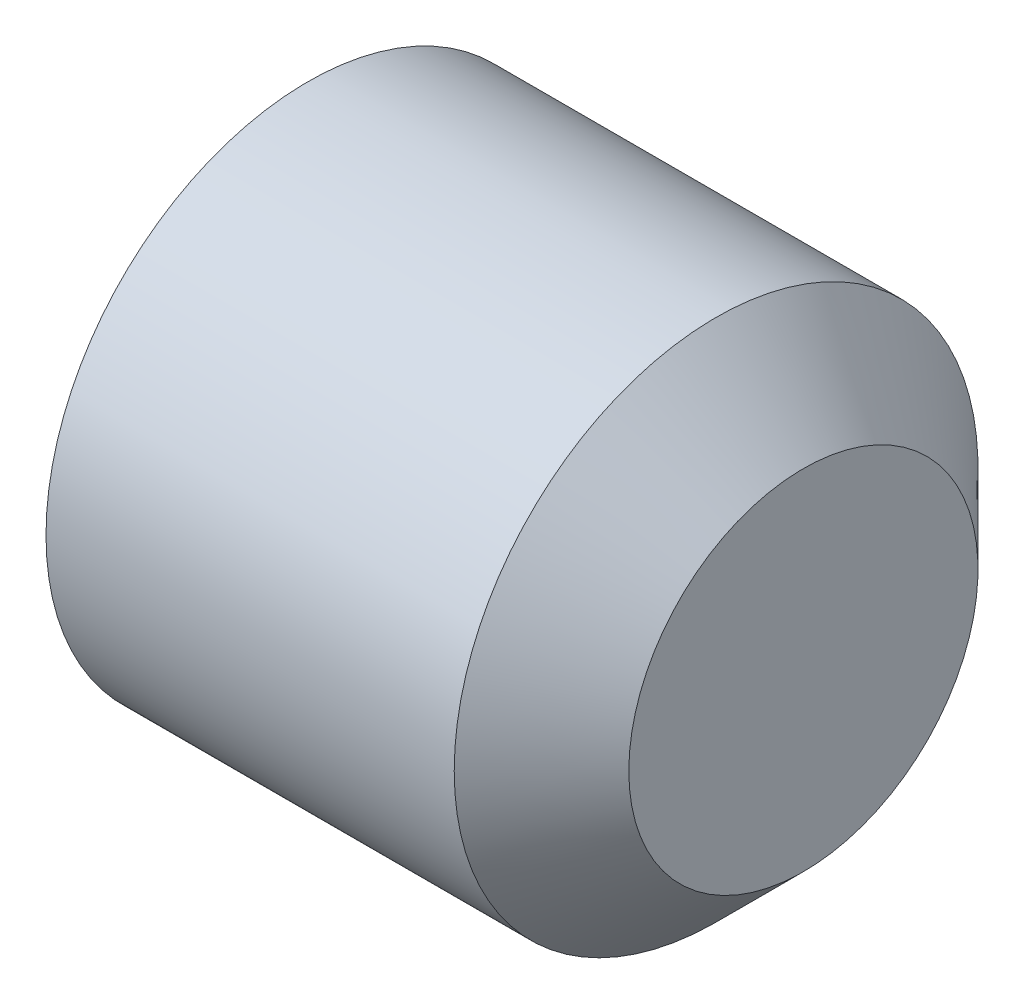
ISO-10303-21;
HEADER;
FILE_DESCRIPTION(('STEP AP214'),'2;1');
FILE_NAME('part.step','',(''),(''),'','','');
FILE_SCHEMA(('AUTOMOTIVE_DESIGN { 1 0 10303 214 1 1 1 1 }'));
ENDSEC;
DATA;
#1=APPLICATION_CONTEXT('core data for automotive mechanical design processes');
#2=APPLICATION_PROTOCOL_DEFINITION('international standard','automotive_design',2000,#1);
#3=PRODUCT_CONTEXT('',#1,'mechanical');
#4=PRODUCT('Part','Part','',(#3));
#5=PRODUCT_RELATED_PRODUCT_CATEGORY('part','',(#4));
#6=PRODUCT_DEFINITION_FORMATION('','',#4);
#7=PRODUCT_DEFINITION_CONTEXT('part definition',#1,'design');
#8=PRODUCT_DEFINITION('design','',#6,#7);
#9=PRODUCT_DEFINITION_SHAPE('','',#8);
#10=(LENGTH_UNIT() NAMED_UNIT(*) SI_UNIT(.MILLI.,.METRE.));
#11=(NAMED_UNIT(*) PLANE_ANGLE_UNIT() SI_UNIT($,.RADIAN.));
#12=(NAMED_UNIT(*) SI_UNIT($,.STERADIAN.) SOLID_ANGLE_UNIT());
#13=UNCERTAINTY_MEASURE_WITH_UNIT(LENGTH_MEASURE(1.E-05),#10,'distance_accuracy_value','');
#14=(GEOMETRIC_REPRESENTATION_CONTEXT(3) GLOBAL_UNCERTAINTY_ASSIGNED_CONTEXT((#13)) GLOBAL_UNIT_ASSIGNED_CONTEXT((#10,
#11,#12)) REPRESENTATION_CONTEXT('',''));
#15=CARTESIAN_POINT('',(0.,0.,0.));
#16=DIRECTION('',(0.,0.,1.));
#17=DIRECTION('',(1.,0.,0.));
#18=AXIS2_PLACEMENT_3D('',#15,#16,#17);
#19=CARTESIAN_POINT('',(0.,0.,0.));
#20=DIRECTION('',(-1.,0.,0.));
#21=DIRECTION('',(0.,0.,1.));
#22=AXIS2_PLACEMENT_3D('',#19,#20,#21);
#23=PLANE('',#22);
#24=CARTESIAN_POINT('',(0.,0.,0.));
#25=DIRECTION('',(-1.,0.,0.));
#26=DIRECTION('',(0.,0.,1.));
#27=AXIS2_PLACEMENT_3D('',#24,#25,#26);
#28=CIRCLE('',#27,1.2195);
#29=CARTESIAN_POINT('',(0.,0.,1.2195));
#30=VERTEX_POINT('',#29);
#31=EDGE_CURVE('E138',#30,#30,#28,.T.);
#32=ORIENTED_EDGE('',*,*,#31,.T.);
#33=EDGE_LOOP('',(#32));
#34=FACE_BOUND('',#33,.T.);
#35=DIRECTION('',(0.,0.,-1.));
#36=VECTOR('',#35,1.);
#37=CARTESIAN_POINT('',(0.,0.750000000000003,0.433012701892216));
#38=LINE('',#37,#36);
#39=CARTESIAN_POINT('',(0.,0.750000000000003,0.433012701892216));
#40=VERTEX_POINT('',#39);
#41=CARTESIAN_POINT('',(0.,0.750000000000003,-0.433012701892222));
#42=VERTEX_POINT('',#41);
#43=EDGE_CURVE('E129',#40,#42,#38,.T.);
#44=ORIENTED_EDGE('',*,*,#43,.F.);
#45=DIRECTION('',(0.,-0.866025403784439,0.5));
#46=VECTOR('',#45,1.);
#47=CARTESIAN_POINT('',(0.,0.750000000000003,0.433012701892216));
#48=LINE('',#47,#46);
#49=CARTESIAN_POINT('',(0.,0.,0.866025403784435));
#50=VERTEX_POINT('',#49);
#51=EDGE_CURVE('E51',#40,#50,#48,.T.);
#52=ORIENTED_EDGE('',*,*,#51,.T.);
#53=DIRECTION('',(0.,0.866025403784439,0.5));
#54=VECTOR('',#53,1.);
#55=CARTESIAN_POINT('',(0.,-0.749999999999996,0.433012701892216));
#56=LINE('',#55,#54);
#57=CARTESIAN_POINT('',(0.,-0.749999999999996,0.433012701892216));
#58=VERTEX_POINT('',#57);
#59=EDGE_CURVE('E120',#58,#50,#56,.T.);
#60=ORIENTED_EDGE('',*,*,#59,.F.);
#61=DIRECTION('',(0.,0.,-1.));
#62=VECTOR('',#61,1.);
#63=CARTESIAN_POINT('',(0.,-0.749999999999996,0.433012701892216));
#64=LINE('',#63,#62);
#65=CARTESIAN_POINT('',(0.,-0.749999999999996,-0.433012701892222));
#66=VERTEX_POINT('',#65);
#67=EDGE_CURVE('E123',#58,#66,#64,.T.);
#68=ORIENTED_EDGE('',*,*,#67,.T.);
#69=DIRECTION('',(0.,0.866025403784438,-0.500000000000001));
#70=VECTOR('',#69,1.);
#71=CARTESIAN_POINT('',(0.,-0.749999999999996,-0.433012701892222));
#72=LINE('',#71,#70);
#73=CARTESIAN_POINT('',(0.,0.,-0.866025403784441));
#74=VERTEX_POINT('',#73);
#75=EDGE_CURVE('E126',#66,#74,#72,.T.);
#76=ORIENTED_EDGE('',*,*,#75,.T.);
#77=DIRECTION('',(0.,-0.866025403784439,-0.5));
#78=VECTOR('',#77,1.);
#79=CARTESIAN_POINT('',(0.,0.750000000000003,-0.433012701892222));
#80=LINE('',#79,#78);
#81=EDGE_CURVE('E109',#42,#74,#80,.T.);
#82=ORIENTED_EDGE('',*,*,#81,.F.);
#83=EDGE_LOOP('',(#44,#52,#60,#68,#76,#82));
#84=FACE_BOUND('',#83,.T.);
#85=ADVANCED_FACE('F36',(#34,#84),#23,.T.);
#86=CARTESIAN_POINT('',(3.,1.,0.));
#87=DIRECTION('',(1.,0.,0.));
#88=DIRECTION('',(0.,0.,-1.));
#89=AXIS2_PLACEMENT_3D('',#86,#87,#88);
#90=PLANE('',#89);
#91=CARTESIAN_POINT('',(3.,0.,0.));
#92=DIRECTION('',(-1.,0.,0.));
#93=DIRECTION('',(0.,0.,1.));
#94=AXIS2_PLACEMENT_3D('',#91,#92,#93);
#95=CIRCLE('',#94,1.);
#96=CARTESIAN_POINT('',(3.,0.,1.));
#97=VERTEX_POINT('',#96);
#98=EDGE_CURVE('E11',#97,#97,#95,.T.);
#99=ORIENTED_EDGE('',*,*,#98,.F.);
#100=EDGE_LOOP('',(#99));
#101=FACE_BOUND('',#100,.T.);
#102=ADVANCED_FACE('F38',(#101),#90,.T.);
#103=CARTESIAN_POINT('',(2.50000000000001,0.,0.));
#104=DIRECTION('',(-1.,0.,0.));
#105=DIRECTION('',(0.,0.,1.));
#106=AXIS2_PLACEMENT_3D('',#103,#104,#105);
#107=CONICAL_SURFACE('',#106,1.5,0.785398163397455);
#108=ORIENTED_EDGE('',*,*,#98,.T.);
#109=EDGE_LOOP('',(#108));
#110=FACE_BOUND('',#109,.T.);
#111=CARTESIAN_POINT('',(2.50000000000001,0.,0.));
#112=DIRECTION('',(-1.,0.,0.));
#113=DIRECTION('',(0.,0.,1.));
#114=AXIS2_PLACEMENT_3D('',#111,#112,#113);
#115=CIRCLE('',#114,1.5);
#116=CARTESIAN_POINT('',(2.50000000000001,0.,1.5));
#117=VERTEX_POINT('',#116);
#118=EDGE_CURVE('E44',#117,#117,#115,.T.);
#119=ORIENTED_EDGE('',*,*,#118,.F.);
#120=EDGE_LOOP('',(#119));
#121=FACE_BOUND('',#120,.T.);
#122=ADVANCED_FACE('F149',(#110,#121),#107,.T.);
#123=CARTESIAN_POINT('',(-12.7,0.,0.));
#124=DIRECTION('',(-1.,0.,0.));
#125=DIRECTION('',(0.,0.,1.));
#126=AXIS2_PLACEMENT_3D('',#123,#124,#125);
#127=CYLINDRICAL_SURFACE('',#126,1.5);
#128=ORIENTED_EDGE('',*,*,#118,.T.);
#129=EDGE_LOOP('',(#128));
#130=FACE_BOUND('',#129,.T.);
#131=CARTESIAN_POINT('',(0.161946750507689,0.,0.));
#132=DIRECTION('',(-1.,0.,0.));
#133=DIRECTION('',(0.,0.,1.));
#134=AXIS2_PLACEMENT_3D('',#131,#132,#133);
#135=CIRCLE('',#134,1.5);
#136=CARTESIAN_POINT('',(0.161946750507689,0.,1.5));
#137=VERTEX_POINT('',#136);
#138=EDGE_CURVE('E141',#137,#137,#135,.T.);
#139=ORIENTED_EDGE('',*,*,#138,.F.);
#140=EDGE_LOOP('',(#139));
#141=FACE_BOUND('',#140,.T.);
#142=ADVANCED_FACE('F146',(#130,#141),#127,.T.);
#143=CARTESIAN_POINT('',(0.,0.,0.));
#144=DIRECTION('',(1.,0.,0.));
#145=DIRECTION('',(0.,0.,-1.));
#146=AXIS2_PLACEMENT_3D('',#143,#144,#145);
#147=CONICAL_SURFACE('',#146,1.2195,1.0471975511966);
#148=ORIENTED_EDGE('',*,*,#138,.T.);
#149=EDGE_LOOP('',(#148));
#150=FACE_BOUND('',#149,.T.);
#151=ORIENTED_EDGE('',*,*,#31,.F.);
#152=EDGE_LOOP('',(#151));
#153=FACE_BOUND('',#152,.T.);
#154=ADVANCED_FACE('F156',(#150,#153),#147,.T.);
#155=CARTESIAN_POINT('',(1.5,0.750000000000003,0.433012701892216));
#156=DIRECTION('',(0.,-0.5,-0.866025403784438));
#157=DIRECTION('',(0.,0.866025403784439,-0.5));
#158=AXIS2_PLACEMENT_3D('',#155,#156,#157);
#159=PLANE('',#158);
#160=ORIENTED_EDGE('',*,*,#51,.F.);
#161=DIRECTION('',(-1.,0.,0.));
#162=VECTOR('',#161,1.);
#163=CARTESIAN_POINT('',(1.5,0.750000000000003,0.433012701892216));
#164=LINE('',#163,#162);
#165=CARTESIAN_POINT('',(1.5,0.750000000000003,0.433012701892216));
#166=VERTEX_POINT('',#165);
#167=EDGE_CURVE('E56',#166,#40,#164,.T.);
#168=ORIENTED_EDGE('',*,*,#167,.F.);
#169=DIRECTION('',(0.,-0.866025403784439,0.5));
#170=VECTOR('',#169,1.);
#171=CARTESIAN_POINT('',(1.5,0.750000000000003,0.433012701892216));
#172=LINE('',#171,#170);
#173=CARTESIAN_POINT('',(1.5,0.,0.866025403784435));
#174=VERTEX_POINT('',#173);
#175=EDGE_CURVE('E83',#166,#174,#172,.T.);
#176=ORIENTED_EDGE('',*,*,#175,.T.);
#177=DIRECTION('',(-1.,0.,0.));
#178=VECTOR('',#177,1.);
#179=CARTESIAN_POINT('',(1.5,0.,0.866025403784435));
#180=LINE('',#179,#178);
#181=EDGE_CURVE('E136',#174,#50,#180,.T.);
#182=ORIENTED_EDGE('',*,*,#181,.T.);
#183=EDGE_LOOP('',(#160,#168,#176,#182));
#184=FACE_BOUND('',#183,.T.);
#185=ADVANCED_FACE('F167',(#184),#159,.T.);
#186=CARTESIAN_POINT('',(1.5,-0.749999999999996,0.433012701892216));
#187=DIRECTION('',(0.,-0.5,0.866025403784439));
#188=DIRECTION('',(0.,-0.866025403784439,-0.5));
#189=AXIS2_PLACEMENT_3D('',#186,#187,#188);
#190=PLANE('',#189);
#191=ORIENTED_EDGE('',*,*,#59,.T.);
#192=ORIENTED_EDGE('',*,*,#181,.F.);
#193=DIRECTION('',(0.,0.866025403784439,0.5));
#194=VECTOR('',#193,1.);
#195=CARTESIAN_POINT('',(1.5,-0.749999999999996,0.433012701892216));
#196=LINE('',#195,#194);
#197=CARTESIAN_POINT('',(1.5,-0.749999999999996,0.433012701892216));
#198=VERTEX_POINT('',#197);
#199=EDGE_CURVE('E269',#198,#174,#196,.T.);
#200=ORIENTED_EDGE('',*,*,#199,.F.);
#201=DIRECTION('',(-1.,0.,0.));
#202=VECTOR('',#201,1.);
#203=CARTESIAN_POINT('',(1.5,-0.749999999999996,0.433012701892216));
#204=LINE('',#203,#202);
#205=EDGE_CURVE('E134',#198,#58,#204,.T.);
#206=ORIENTED_EDGE('',*,*,#205,.T.);
#207=EDGE_LOOP('',(#191,#192,#200,#206));
#208=FACE_BOUND('',#207,.T.);
#209=ADVANCED_FACE('F174',(#208),#190,.F.);
#210=CARTESIAN_POINT('',(1.5,-0.749999999999996,0.433012701892216));
#211=DIRECTION('',(0.,1.,0.));
#212=DIRECTION('',(0.,0.,1.));
#213=AXIS2_PLACEMENT_3D('',#210,#211,#212);
#214=PLANE('',#213);
#215=ORIENTED_EDGE('',*,*,#67,.F.);
#216=ORIENTED_EDGE('',*,*,#205,.F.);
#217=DIRECTION('',(0.,0.,-1.));
#218=VECTOR('',#217,1.);
#219=CARTESIAN_POINT('',(1.5,-0.749999999999996,0.433012701892216));
#220=LINE('',#219,#218);
#221=CARTESIAN_POINT('',(1.5,-0.749999999999996,-0.433012701892222));
#222=VERTEX_POINT('',#221);
#223=EDGE_CURVE('E104',#198,#222,#220,.T.);
#224=ORIENTED_EDGE('',*,*,#223,.T.);
#225=DIRECTION('',(-1.,0.,0.));
#226=VECTOR('',#225,1.);
#227=CARTESIAN_POINT('',(1.5,-0.749999999999996,-0.433012701892222));
#228=LINE('',#227,#226);
#229=EDGE_CURVE('E99',#222,#66,#228,.T.);
#230=ORIENTED_EDGE('',*,*,#229,.T.);
#231=EDGE_LOOP('',(#215,#216,#224,#230));
#232=FACE_BOUND('',#231,.T.);
#233=ADVANCED_FACE('F181',(#232),#214,.T.);
#234=CARTESIAN_POINT('',(1.5,-0.749999999999996,-0.433012701892222));
#235=DIRECTION('',(0.,0.500000000000001,0.866025403784438));
#236=DIRECTION('',(0.,-0.866025403784438,0.500000000000001));
#237=AXIS2_PLACEMENT_3D('',#234,#235,#236);
#238=PLANE('',#237);
#239=ORIENTED_EDGE('',*,*,#75,.F.);
#240=ORIENTED_EDGE('',*,*,#229,.F.);
#241=DIRECTION('',(0.,0.866025403784438,-0.500000000000001));
#242=VECTOR('',#241,1.);
#243=CARTESIAN_POINT('',(1.5,-0.749999999999996,-0.433012701892222));
#244=LINE('',#243,#242);
#245=CARTESIAN_POINT('',(1.5,0.,-0.866025403784441));
#246=VERTEX_POINT('',#245);
#247=EDGE_CURVE('E94',#222,#246,#244,.T.);
#248=ORIENTED_EDGE('',*,*,#247,.T.);
#249=DIRECTION('',(-1.,0.,0.));
#250=VECTOR('',#249,1.);
#251=CARTESIAN_POINT('',(1.5,0.,-0.866025403784441));
#252=LINE('',#251,#250);
#253=EDGE_CURVE('E98',#246,#74,#252,.T.);
#254=ORIENTED_EDGE('',*,*,#253,.T.);
#255=EDGE_LOOP('',(#239,#240,#248,#254));
#256=FACE_BOUND('',#255,.T.);
#257=ADVANCED_FACE('F97',(#256),#238,.T.);
#258=CARTESIAN_POINT('',(1.5,0.750000000000003,-0.433012701892222));
#259=DIRECTION('',(0.,0.5,-0.866025403784439));
#260=DIRECTION('',(0.,0.866025403784439,0.5));
#261=AXIS2_PLACEMENT_3D('',#258,#259,#260);
#262=PLANE('',#261);
#263=ORIENTED_EDGE('',*,*,#81,.T.);
#264=ORIENTED_EDGE('',*,*,#253,.F.);
#265=DIRECTION('',(0.,-0.866025403784439,-0.5));
#266=VECTOR('',#265,1.);
#267=CARTESIAN_POINT('',(1.5,0.750000000000003,-0.433012701892222));
#268=LINE('',#267,#266);
#269=CARTESIAN_POINT('',(1.5,0.750000000000003,-0.433012701892222));
#270=VERTEX_POINT('',#269);
#271=EDGE_CURVE('E103',#270,#246,#268,.T.);
#272=ORIENTED_EDGE('',*,*,#271,.F.);
#273=DIRECTION('',(-1.,0.,0.));
#274=VECTOR('',#273,1.);
#275=CARTESIAN_POINT('',(1.5,0.750000000000003,-0.433012701892222));
#276=LINE('',#275,#274);
#277=EDGE_CURVE('E79',#270,#42,#276,.T.);
#278=ORIENTED_EDGE('',*,*,#277,.T.);
#279=EDGE_LOOP('',(#263,#264,#272,#278));
#280=FACE_BOUND('',#279,.T.);
#281=ADVANCED_FACE('F106',(#280),#262,.F.);
#282=CARTESIAN_POINT('',(1.5,0.750000000000003,0.433012701892216));
#283=DIRECTION('',(0.,1.,0.));
#284=DIRECTION('',(0.,0.,1.));
#285=AXIS2_PLACEMENT_3D('',#282,#283,#284);
#286=PLANE('',#285);
#287=ORIENTED_EDGE('',*,*,#43,.T.);
#288=ORIENTED_EDGE('',*,*,#277,.F.);
#289=DIRECTION('',(0.,0.,-1.));
#290=VECTOR('',#289,1.);
#291=CARTESIAN_POINT('',(1.5,0.750000000000003,0.433012701892216));
#292=LINE('',#291,#290);
#293=EDGE_CURVE('E114',#166,#270,#292,.T.);
#294=ORIENTED_EDGE('',*,*,#293,.F.);
#295=ORIENTED_EDGE('',*,*,#167,.T.);
#296=EDGE_LOOP('',(#287,#288,#294,#295));
#297=FACE_BOUND('',#296,.T.);
#298=ADVANCED_FACE('F193',(#297),#286,.F.);
#299=CARTESIAN_POINT('',(1.5,1.5,0.));
#300=DIRECTION('',(1.,0.,0.));
#301=DIRECTION('',(0.,0.,-1.));
#302=AXIS2_PLACEMENT_3D('',#299,#300,#301);
#303=PLANE('',#302);
#304=ORIENTED_EDGE('',*,*,#175,.F.);
#305=ORIENTED_EDGE('',*,*,#293,.T.);
#306=ORIENTED_EDGE('',*,*,#271,.T.);
#307=ORIENTED_EDGE('',*,*,#247,.F.);
#308=ORIENTED_EDGE('',*,*,#223,.F.);
#309=ORIENTED_EDGE('',*,*,#199,.T.);
#310=EDGE_LOOP('',(#304,#305,#306,#307,#308,#309));
#311=FACE_BOUND('',#310,.T.);
#312=ADVANCED_FACE('F112',(#311),#303,.F.);
#313=CLOSED_SHELL('',(#85,#102,#122,#142,#154,#185,#209,#233,#257,#281,#298,#312));
#314=MANIFOLD_SOLID_BREP('B2',#313);
#315=ADVANCED_BREP_SHAPE_REPRESENTATION('',(#18,#314),#14);
#316=SHAPE_DEFINITION_REPRESENTATION(#9,#315);
ENDSEC;
END-ISO-10303-21;
